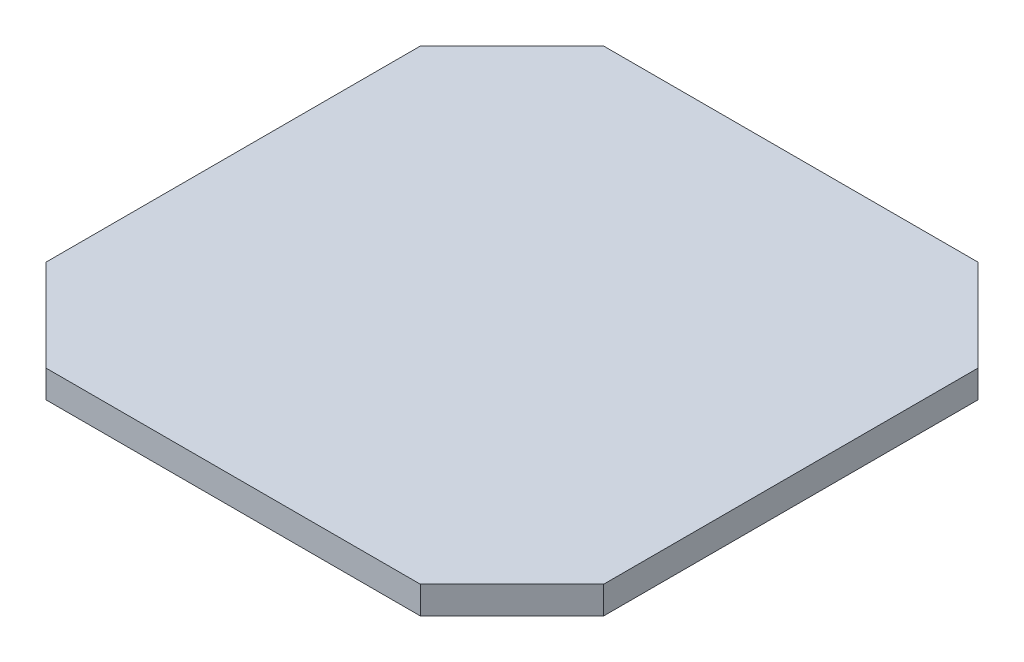
ISO-10303-21;
HEADER;
FILE_DESCRIPTION(('STEP AP214'),'2;1');
FILE_NAME('part.step','',(''),(''),'','','');
FILE_SCHEMA(('AUTOMOTIVE_DESIGN { 1 0 10303 214 1 1 1 1 }'));
ENDSEC;
DATA;
#1=APPLICATION_CONTEXT('core data for automotive mechanical design processes');
#2=APPLICATION_PROTOCOL_DEFINITION('international standard','automotive_design',2000,#1);
#3=PRODUCT_CONTEXT('',#1,'mechanical');
#4=PRODUCT('Part','Part','',(#3));
#5=PRODUCT_RELATED_PRODUCT_CATEGORY('part','',(#4));
#6=PRODUCT_DEFINITION_FORMATION('','',#4);
#7=PRODUCT_DEFINITION_CONTEXT('part definition',#1,'design');
#8=PRODUCT_DEFINITION('design','',#6,#7);
#9=PRODUCT_DEFINITION_SHAPE('','',#8);
#10=(LENGTH_UNIT() NAMED_UNIT(*) SI_UNIT(.MILLI.,.METRE.));
#11=(NAMED_UNIT(*) PLANE_ANGLE_UNIT() SI_UNIT($,.RADIAN.));
#12=(NAMED_UNIT(*) SI_UNIT($,.STERADIAN.) SOLID_ANGLE_UNIT());
#13=UNCERTAINTY_MEASURE_WITH_UNIT(LENGTH_MEASURE(1.E-05),#10,'distance_accuracy_value','');
#14=(GEOMETRIC_REPRESENTATION_CONTEXT(3) GLOBAL_UNCERTAINTY_ASSIGNED_CONTEXT((#13)) GLOBAL_UNIT_ASSIGNED_CONTEXT((#10,
#11,#12)) REPRESENTATION_CONTEXT('',''));
#15=CARTESIAN_POINT('',(0.,0.,0.));
#16=DIRECTION('',(0.,0.,1.));
#17=DIRECTION('',(1.,0.,0.));
#18=AXIS2_PLACEMENT_3D('',#15,#16,#17);
#19=CARTESIAN_POINT('',(0.,0.3,0.));
#20=DIRECTION('',(1.,0.,0.));
#21=DIRECTION('',(0.,0.,-1.));
#22=AXIS2_PLACEMENT_3D('',#19,#20,#21);
#23=PLANE('',#22);
#24=DIRECTION('',(0.,0.,1.));
#25=VECTOR('',#24,1.);
#26=CARTESIAN_POINT('',(0.,0.3,0.));
#27=LINE('',#26,#25);
#28=CARTESIAN_POINT('',(0.,0.3,-5.08));
#29=VERTEX_POINT('',#28);
#30=CARTESIAN_POINT('',(0.,0.3,-1.));
#31=VERTEX_POINT('',#30);
#32=EDGE_CURVE('E125',#29,#31,#27,.T.);
#33=ORIENTED_EDGE('',*,*,#32,.F.);
#34=DIRECTION('',(0.,-1.,0.));
#35=VECTOR('',#34,1.);
#36=CARTESIAN_POINT('',(0.,0.3,-5.08));
#37=LINE('',#36,#35);
#38=CARTESIAN_POINT('',(0.,0.,-5.08));
#39=VERTEX_POINT('',#38);
#40=EDGE_CURVE('E151',#29,#39,#37,.T.);
#41=ORIENTED_EDGE('',*,*,#40,.T.);
#42=DIRECTION('',(0.,0.,1.));
#43=VECTOR('',#42,1.);
#44=CARTESIAN_POINT('',(0.,0.,0.));
#45=LINE('',#44,#43);
#46=CARTESIAN_POINT('',(0.,0.,-1.));
#47=VERTEX_POINT('',#46);
#48=EDGE_CURVE('E157',#39,#47,#45,.T.);
#49=ORIENTED_EDGE('',*,*,#48,.T.);
#50=DIRECTION('',(0.,1.,0.));
#51=VECTOR('',#50,1.);
#52=CARTESIAN_POINT('',(0.,0.3,-1.));
#53=LINE('',#52,#51);
#54=EDGE_CURVE('E149',#47,#31,#53,.T.);
#55=ORIENTED_EDGE('',*,*,#54,.T.);
#56=EDGE_LOOP('',(#33,#41,#49,#55));
#57=FACE_BOUND('',#56,.T.);
#58=ADVANCED_FACE('F33',(#57),#23,.F.);
#59=CARTESIAN_POINT('',(0.,0.3,0.));
#60=DIRECTION('',(0.,0.,-1.));
#61=DIRECTION('',(-1.,0.,0.));
#62=AXIS2_PLACEMENT_3D('',#59,#60,#61);
#63=PLANE('',#62);
#64=DIRECTION('',(1.,0.,0.));
#65=VECTOR('',#64,1.);
#66=CARTESIAN_POINT('',(0.,0.3,0.));
#67=LINE('',#66,#65);
#68=CARTESIAN_POINT('',(1.,0.3,0.));
#69=VERTEX_POINT('',#68);
#70=CARTESIAN_POINT('',(5.08,0.3,0.));
#71=VERTEX_POINT('',#70);
#72=EDGE_CURVE('E128',#69,#71,#67,.T.);
#73=ORIENTED_EDGE('',*,*,#72,.F.);
#74=DIRECTION('',(0.,-1.,0.));
#75=VECTOR('',#74,1.);
#76=CARTESIAN_POINT('',(1.,0.3,0.));
#77=LINE('',#76,#75);
#78=CARTESIAN_POINT('',(1.,0.,0.));
#79=VERTEX_POINT('',#78);
#80=EDGE_CURVE('E11',#69,#79,#77,.T.);
#81=ORIENTED_EDGE('',*,*,#80,.T.);
#82=DIRECTION('',(1.,0.,0.));
#83=VECTOR('',#82,1.);
#84=CARTESIAN_POINT('',(0.,0.,0.));
#85=LINE('',#84,#83);
#86=CARTESIAN_POINT('',(5.08,0.,0.));
#87=VERTEX_POINT('',#86);
#88=EDGE_CURVE('E130',#79,#87,#85,.T.);
#89=ORIENTED_EDGE('',*,*,#88,.T.);
#90=DIRECTION('',(0.,1.,0.));
#91=VECTOR('',#90,1.);
#92=CARTESIAN_POINT('',(5.08,0.3,0.));
#93=LINE('',#92,#91);
#94=EDGE_CURVE('E41',#87,#71,#93,.T.);
#95=ORIENTED_EDGE('',*,*,#94,.T.);
#96=EDGE_LOOP('',(#73,#81,#89,#95));
#97=FACE_BOUND('',#96,.T.);
#98=ADVANCED_FACE('F176',(#97),#63,.F.);
#99=CARTESIAN_POINT('',(6.08,0.3,0.));
#100=DIRECTION('',(-1.,0.,0.));
#101=DIRECTION('',(0.,0.,1.));
#102=AXIS2_PLACEMENT_3D('',#99,#100,#101);
#103=PLANE('',#102);
#104=DIRECTION('',(0.,0.,-1.));
#105=VECTOR('',#104,1.);
#106=CARTESIAN_POINT('',(6.08,0.,0.));
#107=LINE('',#106,#105);
#108=CARTESIAN_POINT('',(6.08,0.,-1.));
#109=VERTEX_POINT('',#108);
#110=CARTESIAN_POINT('',(6.08,0.,-5.08));
#111=VERTEX_POINT('',#110);
#112=EDGE_CURVE('E126',#109,#111,#107,.T.);
#113=ORIENTED_EDGE('',*,*,#112,.T.);
#114=DIRECTION('',(0.,1.,0.));
#115=VECTOR('',#114,1.);
#116=CARTESIAN_POINT('',(6.08,0.3,-5.08));
#117=LINE('',#116,#115);
#118=CARTESIAN_POINT('',(6.08,0.3,-5.08));
#119=VERTEX_POINT('',#118);
#120=EDGE_CURVE('E104',#111,#119,#117,.T.);
#121=ORIENTED_EDGE('',*,*,#120,.T.);
#122=DIRECTION('',(0.,0.,-1.));
#123=VECTOR('',#122,1.);
#124=CARTESIAN_POINT('',(6.08,0.3,0.));
#125=LINE('',#124,#123);
#126=CARTESIAN_POINT('',(6.08,0.3,-1.));
#127=VERTEX_POINT('',#126);
#128=EDGE_CURVE('E165',#127,#119,#125,.T.);
#129=ORIENTED_EDGE('',*,*,#128,.F.);
#130=DIRECTION('',(0.,-1.,0.));
#131=VECTOR('',#130,1.);
#132=CARTESIAN_POINT('',(6.08,0.3,-1.));
#133=LINE('',#132,#131);
#134=EDGE_CURVE('E109',#127,#109,#133,.T.);
#135=ORIENTED_EDGE('',*,*,#134,.T.);
#136=EDGE_LOOP('',(#113,#121,#129,#135));
#137=FACE_BOUND('',#136,.T.);
#138=ADVANCED_FACE('F175',(#137),#103,.F.);
#139=CARTESIAN_POINT('',(0.,0.3,-6.08));
#140=DIRECTION('',(0.,0.,1.));
#141=DIRECTION('',(1.,0.,0.));
#142=AXIS2_PLACEMENT_3D('',#139,#140,#141);
#143=PLANE('',#142);
#144=DIRECTION('',(-1.,0.,0.));
#145=VECTOR('',#144,1.);
#146=CARTESIAN_POINT('',(0.,0.3,-6.08));
#147=LINE('',#146,#145);
#148=CARTESIAN_POINT('',(5.08,0.3,-6.08));
#149=VERTEX_POINT('',#148);
#150=CARTESIAN_POINT('',(1.,0.3,-6.08));
#151=VERTEX_POINT('',#150);
#152=EDGE_CURVE('E119',#149,#151,#147,.T.);
#153=ORIENTED_EDGE('',*,*,#152,.F.);
#154=DIRECTION('',(0.,-1.,0.));
#155=VECTOR('',#154,1.);
#156=CARTESIAN_POINT('',(5.08,0.3,-6.08));
#157=LINE('',#156,#155);
#158=CARTESIAN_POINT('',(5.08,0.,-6.08));
#159=VERTEX_POINT('',#158);
#160=EDGE_CURVE('E103',#149,#159,#157,.T.);
#161=ORIENTED_EDGE('',*,*,#160,.T.);
#162=DIRECTION('',(-1.,0.,0.));
#163=VECTOR('',#162,1.);
#164=CARTESIAN_POINT('',(0.,0.,-6.08));
#165=LINE('',#164,#163);
#166=CARTESIAN_POINT('',(1.,0.,-6.08));
#167=VERTEX_POINT('',#166);
#168=EDGE_CURVE('E116',#159,#167,#165,.T.);
#169=ORIENTED_EDGE('',*,*,#168,.T.);
#170=DIRECTION('',(0.,1.,0.));
#171=VECTOR('',#170,1.);
#172=CARTESIAN_POINT('',(1.,0.3,-6.08));
#173=LINE('',#172,#171);
#174=EDGE_CURVE('E121',#167,#151,#173,.T.);
#175=ORIENTED_EDGE('',*,*,#174,.T.);
#176=EDGE_LOOP('',(#153,#161,#169,#175));
#177=FACE_BOUND('',#176,.T.);
#178=ADVANCED_FACE('F115',(#177),#143,.F.);
#179=CARTESIAN_POINT('',(0.,0.3,0.));
#180=DIRECTION('',(0.,-1.,0.));
#181=DIRECTION('',(0.,0.,-1.));
#182=AXIS2_PLACEMENT_3D('',#179,#180,#181);
#183=PLANE('',#182);
#184=ORIENTED_EDGE('',*,*,#128,.T.);
#185=DIRECTION('',(0.707106781186546,0.,0.707106781186549));
#186=VECTOR('',#185,1.);
#187=CARTESIAN_POINT('',(5.08,0.3,-6.08));
#188=LINE('',#187,#186);
#189=EDGE_CURVE('E147',#119,#149,#188,.F.);
#190=ORIENTED_EDGE('',*,*,#189,.T.);
#191=ORIENTED_EDGE('',*,*,#152,.T.);
#192=DIRECTION('',(0.707106781186548,0.,-0.707106781186547));
#193=VECTOR('',#192,1.);
#194=CARTESIAN_POINT('',(0.,0.3,-5.08));
#195=LINE('',#194,#193);
#196=EDGE_CURVE('E145',#151,#29,#195,.F.);
#197=ORIENTED_EDGE('',*,*,#196,.T.);
#198=ORIENTED_EDGE('',*,*,#32,.T.);
#199=DIRECTION('',(-0.707106781186546,0.,-0.707106781186549));
#200=VECTOR('',#199,1.);
#201=CARTESIAN_POINT('',(1.,0.3,0.));
#202=LINE('',#201,#200);
#203=EDGE_CURVE('E54',#31,#69,#202,.F.);
#204=ORIENTED_EDGE('',*,*,#203,.T.);
#205=ORIENTED_EDGE('',*,*,#72,.T.);
#206=DIRECTION('',(-0.707106781186548,0.,0.707106781186547));
#207=VECTOR('',#206,1.);
#208=CARTESIAN_POINT('',(6.08,0.3,-1.));
#209=LINE('',#208,#207);
#210=EDGE_CURVE('E142',#71,#127,#209,.F.);
#211=ORIENTED_EDGE('',*,*,#210,.T.);
#212=EDGE_LOOP('',(#184,#190,#191,#197,#198,#204,#205,#211));
#213=FACE_BOUND('',#212,.T.);
#214=ADVANCED_FACE('F169',(#213),#183,.F.);
#215=CARTESIAN_POINT('',(0.,0.,0.));
#216=DIRECTION('',(0.,-1.,0.));
#217=DIRECTION('',(0.,0.,-1.));
#218=AXIS2_PLACEMENT_3D('',#215,#216,#217);
#219=PLANE('',#218);
#220=ORIENTED_EDGE('',*,*,#168,.F.);
#221=DIRECTION('',(-0.707106781186546,0.,-0.707106781186549));
#222=VECTOR('',#221,1.);
#223=CARTESIAN_POINT('',(5.58000000000001,0.,-5.57999999999999));
#224=LINE('',#223,#222);
#225=EDGE_CURVE('E99',#159,#111,#224,.F.);
#226=ORIENTED_EDGE('',*,*,#225,.T.);
#227=ORIENTED_EDGE('',*,*,#112,.F.);
#228=DIRECTION('',(0.707106781186548,0.,-0.707106781186547));
#229=VECTOR('',#228,1.);
#230=CARTESIAN_POINT('',(2.53999999999999,0.,2.54));
#231=LINE('',#230,#229);
#232=EDGE_CURVE('E120',#109,#87,#231,.F.);
#233=ORIENTED_EDGE('',*,*,#232,.T.);
#234=ORIENTED_EDGE('',*,*,#88,.F.);
#235=DIRECTION('',(0.707106781186546,0.,0.707106781186549));
#236=VECTOR('',#235,1.);
#237=CARTESIAN_POINT('',(0.500000000000002,0.,-0.5));
#238=LINE('',#237,#236);
#239=EDGE_CURVE('E136',#79,#47,#238,.F.);
#240=ORIENTED_EDGE('',*,*,#239,.T.);
#241=ORIENTED_EDGE('',*,*,#48,.F.);
#242=DIRECTION('',(-0.707106781186548,0.,0.707106781186547));
#243=VECTOR('',#242,1.);
#244=CARTESIAN_POINT('',(-2.54,0.,-2.54000000000001));
#245=LINE('',#244,#243);
#246=EDGE_CURVE('E110',#39,#167,#245,.F.);
#247=ORIENTED_EDGE('',*,*,#246,.T.);
#248=EDGE_LOOP('',(#220,#226,#227,#233,#234,#240,#241,#247));
#249=FACE_BOUND('',#248,.T.);
#250=ADVANCED_FACE('F123',(#249),#219,.T.);
#251=CARTESIAN_POINT('',(5.08,0.3,-6.08));
#252=DIRECTION('',(-0.707106781186549,0.,0.707106781186546));
#253=DIRECTION('',(0.,-1.,0.));
#254=AXIS2_PLACEMENT_3D('',#251,#252,#253);
#255=PLANE('',#254);
#256=ORIENTED_EDGE('',*,*,#189,.F.);
#257=ORIENTED_EDGE('',*,*,#120,.F.);
#258=ORIENTED_EDGE('',*,*,#225,.F.);
#259=ORIENTED_EDGE('',*,*,#160,.F.);
#260=EDGE_LOOP('',(#256,#257,#258,#259));
#261=FACE_BOUND('',#260,.T.);
#262=ADVANCED_FACE('F102',(#261),#255,.F.);
#263=CARTESIAN_POINT('',(0.,0.3,-5.08));
#264=DIRECTION('',(0.707106781186547,0.,0.707106781186548));
#265=DIRECTION('',(0.,-1.,0.));
#266=AXIS2_PLACEMENT_3D('',#263,#264,#265);
#267=PLANE('',#266);
#268=ORIENTED_EDGE('',*,*,#196,.F.);
#269=ORIENTED_EDGE('',*,*,#174,.F.);
#270=ORIENTED_EDGE('',*,*,#246,.F.);
#271=ORIENTED_EDGE('',*,*,#40,.F.);
#272=EDGE_LOOP('',(#268,#269,#270,#271));
#273=FACE_BOUND('',#272,.T.);
#274=ADVANCED_FACE('F179',(#273),#267,.F.);
#275=CARTESIAN_POINT('',(1.,0.3,0.));
#276=DIRECTION('',(0.707106781186549,0.,-0.707106781186546));
#277=DIRECTION('',(0.,-1.,0.));
#278=AXIS2_PLACEMENT_3D('',#275,#276,#277);
#279=PLANE('',#278);
#280=ORIENTED_EDGE('',*,*,#203,.F.);
#281=ORIENTED_EDGE('',*,*,#54,.F.);
#282=ORIENTED_EDGE('',*,*,#239,.F.);
#283=ORIENTED_EDGE('',*,*,#80,.F.);
#284=EDGE_LOOP('',(#280,#281,#282,#283));
#285=FACE_BOUND('',#284,.T.);
#286=ADVANCED_FACE('F178',(#285),#279,.F.);
#287=CARTESIAN_POINT('',(6.08,0.3,-1.));
#288=DIRECTION('',(-0.707106781186547,0.,-0.707106781186548));
#289=DIRECTION('',(0.,-1.,0.));
#290=AXIS2_PLACEMENT_3D('',#287,#288,#289);
#291=PLANE('',#290);
#292=ORIENTED_EDGE('',*,*,#210,.F.);
#293=ORIENTED_EDGE('',*,*,#94,.F.);
#294=ORIENTED_EDGE('',*,*,#232,.F.);
#295=ORIENTED_EDGE('',*,*,#134,.F.);
#296=EDGE_LOOP('',(#292,#293,#294,#295));
#297=FACE_BOUND('',#296,.T.);
#298=ADVANCED_FACE('F35',(#297),#291,.F.);
#299=CLOSED_SHELL('',(#58,#98,#138,#178,#214,#250,#262,#274,#286,#298));
#300=MANIFOLD_SOLID_BREP('B2',#299);
#301=ADVANCED_BREP_SHAPE_REPRESENTATION('',(#18,#300),#14);
#302=SHAPE_DEFINITION_REPRESENTATION(#9,#301);
ENDSEC;
END-ISO-10303-21;
